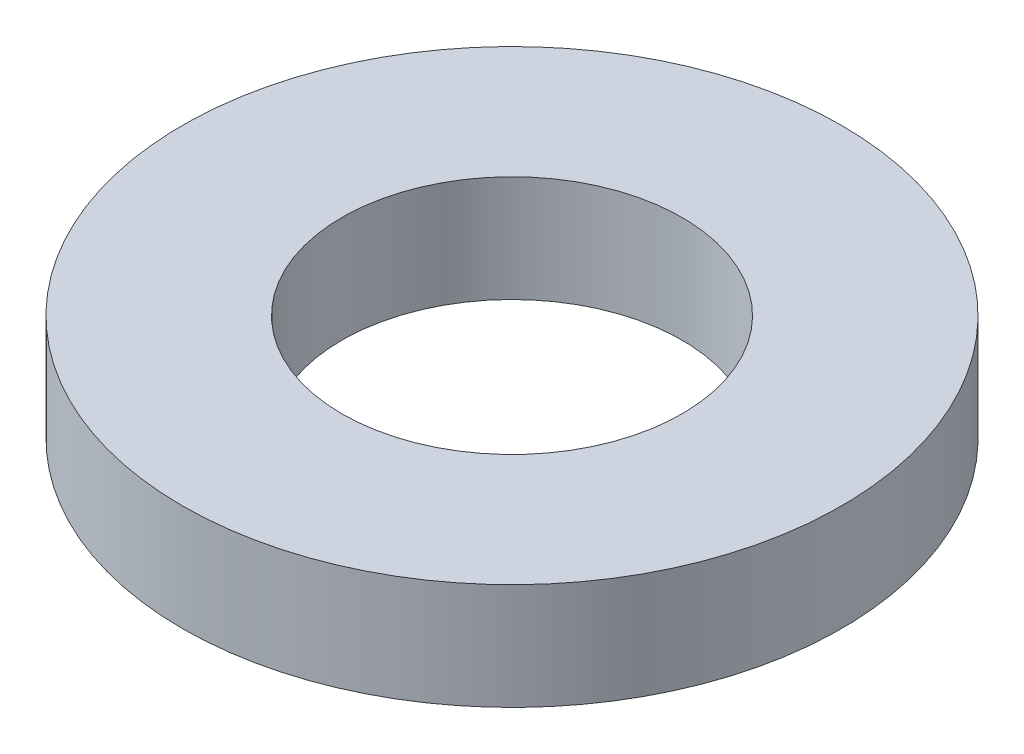
ISO-10303-21;
HEADER;
FILE_DESCRIPTION(('STEP AP214'),'2;1');
FILE_NAME('part.step','',(''),(''),'','','');
FILE_SCHEMA(('AUTOMOTIVE_DESIGN { 1 0 10303 214 1 1 1 1 }'));
ENDSEC;
DATA;
#1=APPLICATION_CONTEXT('core data for automotive mechanical design processes');
#2=APPLICATION_PROTOCOL_DEFINITION('international standard','automotive_design',2000,#1);
#3=PRODUCT_CONTEXT('',#1,'mechanical');
#4=PRODUCT('Part','Part','',(#3));
#5=PRODUCT_RELATED_PRODUCT_CATEGORY('part','',(#4));
#6=PRODUCT_DEFINITION_FORMATION('','',#4);
#7=PRODUCT_DEFINITION_CONTEXT('part definition',#1,'design');
#8=PRODUCT_DEFINITION('design','',#6,#7);
#9=PRODUCT_DEFINITION_SHAPE('','',#8);
#10=(LENGTH_UNIT() NAMED_UNIT(*) SI_UNIT(.MILLI.,.METRE.));
#11=(NAMED_UNIT(*) PLANE_ANGLE_UNIT() SI_UNIT($,.RADIAN.));
#12=(NAMED_UNIT(*) SI_UNIT($,.STERADIAN.) SOLID_ANGLE_UNIT());
#13=UNCERTAINTY_MEASURE_WITH_UNIT(LENGTH_MEASURE(1.E-05),#10,'distance_accuracy_value','');
#14=(GEOMETRIC_REPRESENTATION_CONTEXT(3) GLOBAL_UNCERTAINTY_ASSIGNED_CONTEXT((#13)) GLOBAL_UNIT_ASSIGNED_CONTEXT((#10,
#11,#12)) REPRESENTATION_CONTEXT('',''));
#15=CARTESIAN_POINT('',(0.,0.,0.));
#16=DIRECTION('',(0.,0.,1.));
#17=DIRECTION('',(1.,0.,0.));
#18=AXIS2_PLACEMENT_3D('',#15,#16,#17);
#19=CARTESIAN_POINT('',(0.,1.,0.));
#20=DIRECTION('',(0.,1.,0.));
#21=DIRECTION('',(0.,0.,1.));
#22=AXIS2_PLACEMENT_3D('',#19,#20,#21);
#23=PLANE('',#22);
#24=CARTESIAN_POINT('',(0.,1.,0.));
#25=DIRECTION('',(0.,1.,0.));
#26=DIRECTION('',(0.,0.,1.));
#27=AXIS2_PLACEMENT_3D('',#24,#25,#26);
#28=CIRCLE('',#27,3.1);
#29=CARTESIAN_POINT('',(0.,1.,3.1));
#30=VERTEX_POINT('',#29);
#31=EDGE_CURVE('E10',#30,#30,#28,.T.);
#32=ORIENTED_EDGE('',*,*,#31,.T.);
#33=EDGE_LOOP('',(#32));
#34=FACE_BOUND('',#33,.T.);
#35=CARTESIAN_POINT('',(0.,1.,0.));
#36=DIRECTION('',(0.,1.,0.));
#37=DIRECTION('',(0.,0.,1.));
#38=AXIS2_PLACEMENT_3D('',#35,#36,#37);
#39=CIRCLE('',#38,1.6);
#40=CARTESIAN_POINT('',(0.,1.,1.6));
#41=VERTEX_POINT('',#40);
#42=EDGE_CURVE('E44',#41,#41,#39,.T.);
#43=ORIENTED_EDGE('',*,*,#42,.F.);
#44=EDGE_LOOP('',(#43));
#45=FACE_BOUND('',#44,.T.);
#46=ADVANCED_FACE('F33',(#34,#45),#23,.T.);
#47=CARTESIAN_POINT('',(0.,0.,0.));
#48=DIRECTION('',(0.,1.,0.));
#49=DIRECTION('',(0.,0.,1.));
#50=AXIS2_PLACEMENT_3D('',#47,#48,#49);
#51=PLANE('',#50);
#52=CARTESIAN_POINT('',(0.,0.,0.));
#53=DIRECTION('',(0.,1.,0.));
#54=DIRECTION('',(0.,0.,1.));
#55=AXIS2_PLACEMENT_3D('',#52,#53,#54);
#56=CIRCLE('',#55,3.1);
#57=CARTESIAN_POINT('',(0.,0.,3.1));
#58=VERTEX_POINT('',#57);
#59=EDGE_CURVE('E37',#58,#58,#56,.T.);
#60=ORIENTED_EDGE('',*,*,#59,.F.);
#61=EDGE_LOOP('',(#60));
#62=FACE_BOUND('',#61,.T.);
#63=CARTESIAN_POINT('',(0.,0.,0.));
#64=DIRECTION('',(0.,1.,0.));
#65=DIRECTION('',(0.,0.,1.));
#66=AXIS2_PLACEMENT_3D('',#63,#64,#65);
#67=CIRCLE('',#66,1.6);
#68=CARTESIAN_POINT('',(0.,0.,1.6));
#69=VERTEX_POINT('',#68);
#70=EDGE_CURVE('E46',#69,#69,#67,.T.);
#71=ORIENTED_EDGE('',*,*,#70,.T.);
#72=EDGE_LOOP('',(#71));
#73=FACE_BOUND('',#72,.T.);
#74=ADVANCED_FACE('F56',(#62,#73),#51,.F.);
#75=CARTESIAN_POINT('',(0.,1.,0.));
#76=DIRECTION('',(0.,-1.,0.));
#77=DIRECTION('',(0.,0.,-1.));
#78=AXIS2_PLACEMENT_3D('',#75,#76,#77);
#79=CYLINDRICAL_SURFACE('',#78,3.1);
#80=ORIENTED_EDGE('',*,*,#31,.F.);
#81=EDGE_LOOP('',(#80));
#82=FACE_BOUND('',#81,.T.);
#83=ORIENTED_EDGE('',*,*,#59,.T.);
#84=EDGE_LOOP('',(#83));
#85=FACE_BOUND('',#84,.T.);
#86=ADVANCED_FACE('F35',(#82,#85),#79,.T.);
#87=CARTESIAN_POINT('',(0.,1.,0.));
#88=DIRECTION('',(0.,-1.,0.));
#89=DIRECTION('',(0.,0.,-1.));
#90=AXIS2_PLACEMENT_3D('',#87,#88,#89);
#91=CYLINDRICAL_SURFACE('',#90,1.6);
#92=ORIENTED_EDGE('',*,*,#42,.T.);
#93=EDGE_LOOP('',(#92));
#94=FACE_BOUND('',#93,.T.);
#95=ORIENTED_EDGE('',*,*,#70,.F.);
#96=EDGE_LOOP('',(#95));
#97=FACE_BOUND('',#96,.T.);
#98=ADVANCED_FACE('F52',(#94,#97),#91,.F.);
#99=CLOSED_SHELL('',(#46,#74,#86,#98));
#100=MANIFOLD_SOLID_BREP('B2',#99);
#101=ADVANCED_BREP_SHAPE_REPRESENTATION('',(#18,#100),#14);
#102=SHAPE_DEFINITION_REPRESENTATION(#9,#101);
ENDSEC;
END-ISO-10303-21;
